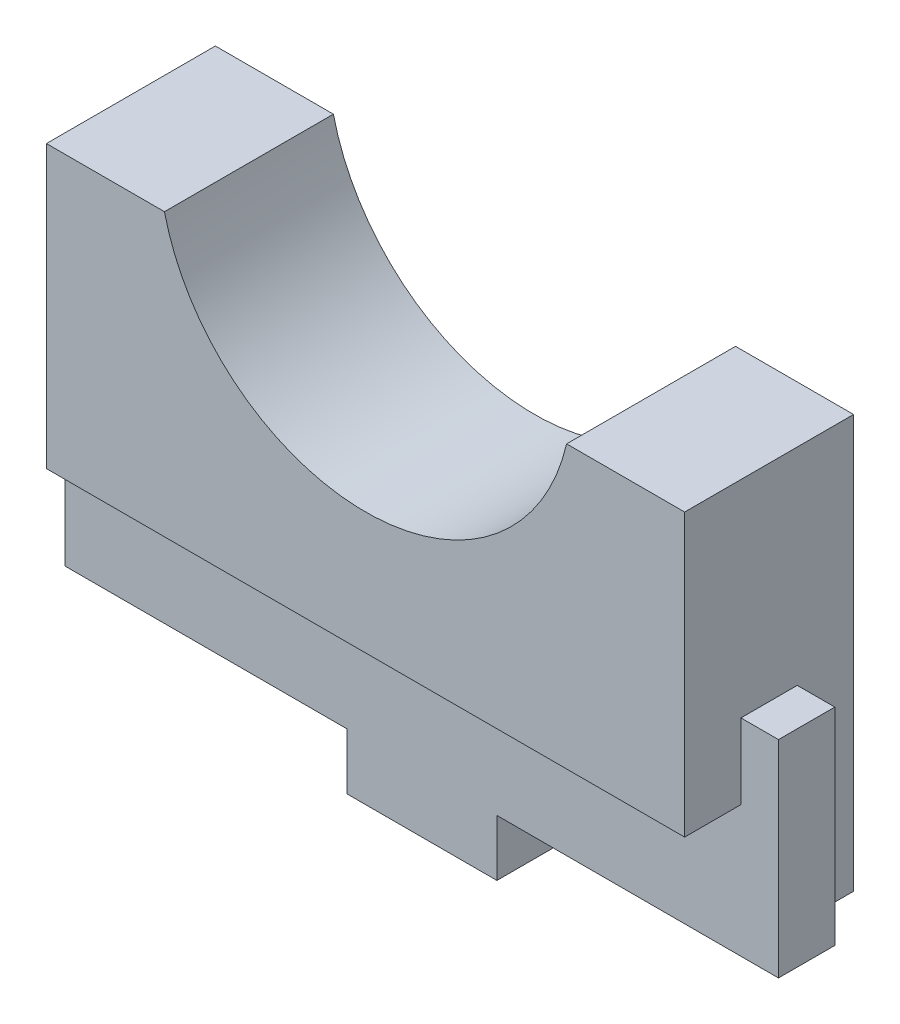
ISO-10303-21;
HEADER;
FILE_DESCRIPTION(('STEP AP214'),'2;1');
FILE_NAME('part.step','',(''),(''),'','','');
FILE_SCHEMA(('AUTOMOTIVE_DESIGN { 1 0 10303 214 1 1 1 1 }'));
ENDSEC;
DATA;
#1=APPLICATION_CONTEXT('core data for automotive mechanical design processes');
#2=APPLICATION_PROTOCOL_DEFINITION('international standard','automotive_design',2000,#1);
#3=PRODUCT_CONTEXT('',#1,'mechanical');
#4=PRODUCT('Part','Part','',(#3));
#5=PRODUCT_RELATED_PRODUCT_CATEGORY('part','',(#4));
#6=PRODUCT_DEFINITION_FORMATION('','',#4);
#7=PRODUCT_DEFINITION_CONTEXT('part definition',#1,'design');
#8=PRODUCT_DEFINITION('design','',#6,#7);
#9=PRODUCT_DEFINITION_SHAPE('','',#8);
#10=(LENGTH_UNIT() NAMED_UNIT(*) SI_UNIT(.MILLI.,.METRE.));
#11=(NAMED_UNIT(*) PLANE_ANGLE_UNIT() SI_UNIT($,.RADIAN.));
#12=(NAMED_UNIT(*) SI_UNIT($,.STERADIAN.) SOLID_ANGLE_UNIT());
#13=UNCERTAINTY_MEASURE_WITH_UNIT(LENGTH_MEASURE(1.E-05),#10,'distance_accuracy_value','');
#14=(GEOMETRIC_REPRESENTATION_CONTEXT(3) GLOBAL_UNCERTAINTY_ASSIGNED_CONTEXT((#13)) GLOBAL_UNIT_ASSIGNED_CONTEXT((#10,
#11,#12)) REPRESENTATION_CONTEXT('',''));
#15=CARTESIAN_POINT('',(0.,0.,0.));
#16=DIRECTION('',(0.,0.,1.));
#17=DIRECTION('',(1.,0.,0.));
#18=AXIS2_PLACEMENT_3D('',#15,#16,#17);
#19=CARTESIAN_POINT('',(17.,0.,9.));
#20=DIRECTION('',(-1.,0.,0.));
#21=DIRECTION('',(0.,0.,1.));
#22=AXIS2_PLACEMENT_3D('',#19,#20,#21);
#23=PLANE('',#22);
#24=DIRECTION('',(0.,1.,0.));
#25=VECTOR('',#24,1.);
#26=CARTESIAN_POINT('',(17.,0.,9.));
#27=LINE('',#26,#25);
#28=CARTESIAN_POINT('',(17.,-17.5,9.));
#29=VERTEX_POINT('',#28);
#30=CARTESIAN_POINT('',(17.,-2.5,9.));
#31=VERTEX_POINT('',#30);
#32=EDGE_CURVE('E173',#29,#31,#27,.T.);
#33=ORIENTED_EDGE('',*,*,#32,.F.);
#34=DIRECTION('',(0.,0.,1.));
#35=VECTOR('',#34,1.);
#36=CARTESIAN_POINT('',(17.,-17.5,6.));
#37=LINE('',#36,#35);
#38=CARTESIAN_POINT('',(17.,-17.5,6.));
#39=VERTEX_POINT('',#38);
#40=EDGE_CURVE('E161',#39,#29,#37,.T.);
#41=ORIENTED_EDGE('',*,*,#40,.F.);
#42=DIRECTION('',(0.,-1.,0.));
#43=VECTOR('',#42,1.);
#44=CARTESIAN_POINT('',(17.,-13.5,6.));
#45=LINE('',#44,#43);
#46=CARTESIAN_POINT('',(17.,-13.5,6.));
#47=VERTEX_POINT('',#46);
#48=EDGE_CURVE('E171',#47,#39,#45,.T.);
#49=ORIENTED_EDGE('',*,*,#48,.F.);
#50=DIRECTION('',(0.,0.,1.));
#51=VECTOR('',#50,1.);
#52=CARTESIAN_POINT('',(17.,-13.5,6.));
#53=LINE('',#52,#51);
#54=CARTESIAN_POINT('',(17.,-13.5,3.));
#55=VERTEX_POINT('',#54);
#56=EDGE_CURVE('E51',#55,#47,#53,.T.);
#57=ORIENTED_EDGE('',*,*,#56,.F.);
#58=DIRECTION('',(0.,1.,0.));
#59=VECTOR('',#58,1.);
#60=CARTESIAN_POINT('',(17.,-13.5,3.));
#61=LINE('',#60,#59);
#62=CARTESIAN_POINT('',(17.,-24.5,3.));
#63=VERTEX_POINT('',#62);
#64=EDGE_CURVE('E56',#63,#55,#61,.T.);
#65=ORIENTED_EDGE('',*,*,#64,.F.);
#66=DIRECTION('',(0.,0.,-1.));
#67=VECTOR('',#66,1.);
#68=CARTESIAN_POINT('',(17.,-24.5,9.));
#69=LINE('',#68,#67);
#70=CARTESIAN_POINT('',(17.,-24.5,0.));
#71=VERTEX_POINT('',#70);
#72=EDGE_CURVE('E221',#63,#71,#69,.T.);
#73=ORIENTED_EDGE('',*,*,#72,.T.);
#74=DIRECTION('',(0.,1.,0.));
#75=VECTOR('',#74,1.);
#76=CARTESIAN_POINT('',(17.,0.,0.));
#77=LINE('',#76,#75);
#78=CARTESIAN_POINT('',(17.,-2.5,0.));
#79=VERTEX_POINT('',#78);
#80=EDGE_CURVE('E310',#71,#79,#77,.T.);
#81=ORIENTED_EDGE('',*,*,#80,.T.);
#82=DIRECTION('',(0.,0.,-1.));
#83=VECTOR('',#82,1.);
#84=CARTESIAN_POINT('',(17.,-2.5,9.));
#85=LINE('',#84,#83);
#86=EDGE_CURVE('E225',#31,#79,#85,.T.);
#87=ORIENTED_EDGE('',*,*,#86,.F.);
#88=EDGE_LOOP('',(#33,#41,#49,#57,#65,#73,#81,#87));
#89=FACE_BOUND('',#88,.T.);
#90=ADVANCED_FACE('F34',(#89),#23,.F.);
#91=CARTESIAN_POINT('',(-17.,0.,9.));
#92=DIRECTION('',(1.,0.,0.));
#93=DIRECTION('',(0.,1.,0.));
#94=AXIS2_PLACEMENT_3D('',#91,#92,#93);
#95=PLANE('',#94);
#96=DIRECTION('',(0.,1.,0.));
#97=VECTOR('',#96,1.);
#98=CARTESIAN_POINT('',(-17.,-13.5,6.));
#99=LINE('',#98,#97);
#100=CARTESIAN_POINT('',(-17.,-17.5,6.));
#101=VERTEX_POINT('',#100);
#102=CARTESIAN_POINT('',(-17.,-13.5,6.));
#103=VERTEX_POINT('',#102);
#104=EDGE_CURVE('E218',#101,#103,#99,.T.);
#105=ORIENTED_EDGE('',*,*,#104,.F.);
#106=DIRECTION('',(0.,0.,1.));
#107=VECTOR('',#106,1.);
#108=CARTESIAN_POINT('',(-17.,-17.5,6.));
#109=LINE('',#108,#107);
#110=CARTESIAN_POINT('',(-17.,-17.5,9.));
#111=VERTEX_POINT('',#110);
#112=EDGE_CURVE('E164',#101,#111,#109,.T.);
#113=ORIENTED_EDGE('',*,*,#112,.T.);
#114=DIRECTION('',(0.,-1.,0.));
#115=VECTOR('',#114,1.);
#116=CARTESIAN_POINT('',(-17.,0.,9.));
#117=LINE('',#116,#115);
#118=CARTESIAN_POINT('',(-17.,-2.5,9.));
#119=VERTEX_POINT('',#118);
#120=EDGE_CURVE('E321',#119,#111,#117,.T.);
#121=ORIENTED_EDGE('',*,*,#120,.F.);
#122=DIRECTION('',(0.,0.,-1.));
#123=VECTOR('',#122,1.);
#124=CARTESIAN_POINT('',(-17.,-2.5,9.));
#125=LINE('',#124,#123);
#126=CARTESIAN_POINT('',(-17.,-2.5,0.));
#127=VERTEX_POINT('',#126);
#128=EDGE_CURVE('E233',#119,#127,#125,.T.);
#129=ORIENTED_EDGE('',*,*,#128,.T.);
#130=DIRECTION('',(0.,-1.,0.));
#131=VECTOR('',#130,1.);
#132=CARTESIAN_POINT('',(-17.,0.,0.));
#133=LINE('',#132,#131);
#134=CARTESIAN_POINT('',(-17.,-24.5,0.));
#135=VERTEX_POINT('',#134);
#136=EDGE_CURVE('E301',#127,#135,#133,.T.);
#137=ORIENTED_EDGE('',*,*,#136,.T.);
#138=DIRECTION('',(0.,0.,-1.));
#139=VECTOR('',#138,1.);
#140=CARTESIAN_POINT('',(-17.,-24.5,9.));
#141=LINE('',#140,#139);
#142=CARTESIAN_POINT('',(-17.,-24.5,3.));
#143=VERTEX_POINT('',#142);
#144=EDGE_CURVE('E224',#143,#135,#141,.T.);
#145=ORIENTED_EDGE('',*,*,#144,.F.);
#146=DIRECTION('',(0.,-1.,0.));
#147=VECTOR('',#146,1.);
#148=CARTESIAN_POINT('',(-17.,-13.5,3.));
#149=LINE('',#148,#147);
#150=CARTESIAN_POINT('',(-17.,-13.5,3.));
#151=VERTEX_POINT('',#150);
#152=EDGE_CURVE('E199',#151,#143,#149,.T.);
#153=ORIENTED_EDGE('',*,*,#152,.F.);
#154=DIRECTION('',(0.,0.,-1.));
#155=VECTOR('',#154,1.);
#156=CARTESIAN_POINT('',(-17.,-13.5,6.));
#157=LINE('',#156,#155);
#158=EDGE_CURVE('E204',#103,#151,#157,.T.);
#159=ORIENTED_EDGE('',*,*,#158,.F.);
#160=EDGE_LOOP('',(#105,#113,#121,#129,#137,#145,#153,#159));
#161=FACE_BOUND('',#160,.T.);
#162=ADVANCED_FACE('F319',(#161),#95,.F.);
#163=CARTESIAN_POINT('',(0.,-24.5,9.));
#164=DIRECTION('',(0.,1.,0.));
#165=DIRECTION('',(-1.,0.,0.));
#166=AXIS2_PLACEMENT_3D('',#163,#164,#165);
#167=PLANE('',#166);
#168=DIRECTION('',(0.,0.,-1.));
#169=VECTOR('',#168,1.);
#170=CARTESIAN_POINT('',(-4.,-24.5,0.));
#171=LINE('',#170,#169);
#172=CARTESIAN_POINT('',(-4.,-24.5,6.));
#173=VERTEX_POINT('',#172);
#174=CARTESIAN_POINT('',(-4.,-24.5,0.));
#175=VERTEX_POINT('',#174);
#176=EDGE_CURVE('E38',#173,#175,#171,.T.);
#177=ORIENTED_EDGE('',*,*,#176,.F.);
#178=DIRECTION('',(1.,0.,0.));
#179=VECTOR('',#178,1.);
#180=CARTESIAN_POINT('',(-19.,-24.5,6.));
#181=LINE('',#180,#179);
#182=CARTESIAN_POINT('',(-19.,-24.5,6.));
#183=VERTEX_POINT('',#182);
#184=EDGE_CURVE('E242',#183,#173,#181,.T.);
#185=ORIENTED_EDGE('',*,*,#184,.F.);
#186=DIRECTION('',(0.,0.,1.));
#187=VECTOR('',#186,1.);
#188=CARTESIAN_POINT('',(-19.,-24.5,6.));
#189=LINE('',#188,#187);
#190=CARTESIAN_POINT('',(-19.,-24.5,3.));
#191=VERTEX_POINT('',#190);
#192=EDGE_CURVE('E203',#191,#183,#189,.T.);
#193=ORIENTED_EDGE('',*,*,#192,.F.);
#194=DIRECTION('',(1.,0.,0.));
#195=VECTOR('',#194,1.);
#196=CARTESIAN_POINT('',(-19.,-24.5,3.));
#197=LINE('',#196,#195);
#198=EDGE_CURVE('E355',#191,#143,#197,.T.);
#199=ORIENTED_EDGE('',*,*,#198,.T.);
#200=ORIENTED_EDGE('',*,*,#144,.T.);
#201=DIRECTION('',(1.,0.,0.));
#202=VECTOR('',#201,1.);
#203=CARTESIAN_POINT('',(0.,-24.5,0.));
#204=LINE('',#203,#202);
#205=EDGE_CURVE('E312',#135,#175,#204,.T.);
#206=ORIENTED_EDGE('',*,*,#205,.T.);
#207=EDGE_LOOP('',(#177,#185,#193,#199,#200,#206));
#208=FACE_BOUND('',#207,.T.);
#209=ADVANCED_FACE('F342',(#208),#167,.F.);
#210=DIRECTION('',(-1.,0.,0.));
#211=VECTOR('',#210,1.);
#212=CARTESIAN_POINT('',(19.,-24.5,6.));
#213=LINE('',#212,#211);
#214=CARTESIAN_POINT('',(19.,-24.5,6.));
#215=VERTEX_POINT('',#214);
#216=CARTESIAN_POINT('',(4.,-24.5,6.));
#217=VERTEX_POINT('',#216);
#218=EDGE_CURVE('E191',#215,#217,#213,.T.);
#219=ORIENTED_EDGE('',*,*,#218,.T.);
#220=DIRECTION('',(0.,0.,1.));
#221=VECTOR('',#220,1.);
#222=CARTESIAN_POINT('',(4.,-24.5,0.));
#223=LINE('',#222,#221);
#224=CARTESIAN_POINT('',(4.,-24.5,0.));
#225=VERTEX_POINT('',#224);
#226=EDGE_CURVE('E266',#225,#217,#223,.T.);
#227=ORIENTED_EDGE('',*,*,#226,.F.);
#228=EDGE_CURVE('E281',#225,#71,#204,.T.);
#229=ORIENTED_EDGE('',*,*,#228,.T.);
#230=ORIENTED_EDGE('',*,*,#72,.F.);
#231=DIRECTION('',(-1.,0.,0.));
#232=VECTOR('',#231,1.);
#233=CARTESIAN_POINT('',(19.,-24.5,3.));
#234=LINE('',#233,#232);
#235=CARTESIAN_POINT('',(19.,-24.5,3.));
#236=VERTEX_POINT('',#235);
#237=EDGE_CURVE('E370',#236,#63,#234,.T.);
#238=ORIENTED_EDGE('',*,*,#237,.F.);
#239=DIRECTION('',(0.,0.,-1.));
#240=VECTOR('',#239,1.);
#241=CARTESIAN_POINT('',(19.,-24.5,6.));
#242=LINE('',#241,#240);
#243=EDGE_CURVE('E369',#215,#236,#242,.T.);
#244=ORIENTED_EDGE('',*,*,#243,.F.);
#245=EDGE_LOOP('',(#219,#227,#229,#230,#238,#244));
#246=FACE_BOUND('',#245,.T.);
#247=ADVANCED_FACE('F334',(#246),#167,.F.);
#248=CARTESIAN_POINT('',(0.,0.,9.));
#249=DIRECTION('',(0.,0.,-1.));
#250=DIRECTION('',(-1.,0.,0.));
#251=AXIS2_PLACEMENT_3D('',#248,#249,#250);
#252=CYLINDRICAL_SURFACE('',#251,11.);
#253=CARTESIAN_POINT('',(0.,0.,0.));
#254=DIRECTION('',(0.,0.,1.));
#255=DIRECTION('',(1.,0.,0.));
#256=AXIS2_PLACEMENT_3D('',#253,#254,#255);
#257=CIRCLE('',#256,11.);
#258=CARTESIAN_POINT('',(-10.7121426428143,-2.5,0.));
#259=VERTEX_POINT('',#258);
#260=CARTESIAN_POINT('',(10.7121426428143,-2.5,0.));
#261=VERTEX_POINT('',#260);
#262=EDGE_CURVE('E289',#259,#261,#257,.T.);
#263=ORIENTED_EDGE('',*,*,#262,.F.);
#264=DIRECTION('',(0.,0.,-1.));
#265=VECTOR('',#264,1.);
#266=CARTESIAN_POINT('',(-10.7121426428143,-2.5,9.));
#267=LINE('',#266,#265);
#268=CARTESIAN_POINT('',(-10.7121426428143,-2.5,9.));
#269=VERTEX_POINT('',#268);
#270=EDGE_CURVE('E44',#269,#259,#267,.T.);
#271=ORIENTED_EDGE('',*,*,#270,.F.);
#272=CARTESIAN_POINT('',(0.,0.,9.));
#273=DIRECTION('',(0.,0.,1.));
#274=DIRECTION('',(1.,0.,0.));
#275=AXIS2_PLACEMENT_3D('',#272,#273,#274);
#276=CIRCLE('',#275,11.);
#277=CARTESIAN_POINT('',(10.7121426428143,-2.5,9.));
#278=VERTEX_POINT('',#277);
#279=EDGE_CURVE('E275',#269,#278,#276,.T.);
#280=ORIENTED_EDGE('',*,*,#279,.T.);
#281=DIRECTION('',(0.,0.,-1.));
#282=VECTOR('',#281,1.);
#283=CARTESIAN_POINT('',(10.7121426428143,-2.5,9.));
#284=LINE('',#283,#282);
#285=EDGE_CURVE('E394',#278,#261,#284,.T.);
#286=ORIENTED_EDGE('',*,*,#285,.T.);
#287=EDGE_LOOP('',(#263,#271,#280,#286));
#288=FACE_BOUND('',#287,.T.);
#289=ADVANCED_FACE('F36',(#288),#252,.F.);
#290=CARTESIAN_POINT('',(0.,-2.5,9.));
#291=DIRECTION('',(0.,1.,0.));
#292=DIRECTION('',(0.,0.,1.));
#293=AXIS2_PLACEMENT_3D('',#290,#291,#292);
#294=PLANE('',#293);
#295=DIRECTION('',(1.,0.,0.));
#296=VECTOR('',#295,1.);
#297=CARTESIAN_POINT('',(0.,-2.5,0.));
#298=LINE('',#297,#296);
#299=EDGE_CURVE('E295',#127,#259,#298,.T.);
#300=ORIENTED_EDGE('',*,*,#299,.F.);
#301=ORIENTED_EDGE('',*,*,#128,.F.);
#302=DIRECTION('',(1.,0.,0.));
#303=VECTOR('',#302,1.);
#304=CARTESIAN_POINT('',(0.,-2.5,9.));
#305=LINE('',#304,#303);
#306=EDGE_CURVE('E390',#119,#269,#305,.T.);
#307=ORIENTED_EDGE('',*,*,#306,.T.);
#308=ORIENTED_EDGE('',*,*,#270,.T.);
#309=EDGE_LOOP('',(#300,#301,#307,#308));
#310=FACE_BOUND('',#309,.T.);
#311=ADVANCED_FACE('F324',(#310),#294,.T.);
#312=EDGE_CURVE('E303',#261,#79,#298,.T.);
#313=ORIENTED_EDGE('',*,*,#312,.F.);
#314=ORIENTED_EDGE('',*,*,#285,.F.);
#315=EDGE_CURVE('E393',#278,#31,#305,.T.);
#316=ORIENTED_EDGE('',*,*,#315,.T.);
#317=ORIENTED_EDGE('',*,*,#86,.T.);
#318=EDGE_LOOP('',(#313,#314,#316,#317));
#319=FACE_BOUND('',#318,.T.);
#320=ADVANCED_FACE('F326',(#319),#294,.T.);
#321=CARTESIAN_POINT('',(0.,0.,9.));
#322=DIRECTION('',(0.,0.,1.));
#323=DIRECTION('',(1.,0.,0.));
#324=AXIS2_PLACEMENT_3D('',#321,#322,#323);
#325=PLANE('',#324);
#326=DIRECTION('',(-1.,0.,0.));
#327=VECTOR('',#326,1.);
#328=CARTESIAN_POINT('',(-17.,-17.5,9.));
#329=LINE('',#328,#327);
#330=EDGE_CURVE('E168',#29,#111,#329,.T.);
#331=ORIENTED_EDGE('',*,*,#330,.F.);
#332=ORIENTED_EDGE('',*,*,#32,.T.);
#333=ORIENTED_EDGE('',*,*,#315,.F.);
#334=ORIENTED_EDGE('',*,*,#279,.F.);
#335=ORIENTED_EDGE('',*,*,#306,.F.);
#336=ORIENTED_EDGE('',*,*,#120,.T.);
#337=EDGE_LOOP('',(#331,#332,#333,#334,#335,#336));
#338=FACE_BOUND('',#337,.T.);
#339=ADVANCED_FACE('F332',(#338),#325,.T.);
#340=CARTESIAN_POINT('',(0.,0.,0.));
#341=DIRECTION('',(0.,0.,1.));
#342=DIRECTION('',(1.,0.,0.));
#343=AXIS2_PLACEMENT_3D('',#340,#341,#342);
#344=PLANE('',#343);
#345=ORIENTED_EDGE('',*,*,#262,.T.);
#346=ORIENTED_EDGE('',*,*,#312,.T.);
#347=ORIENTED_EDGE('',*,*,#80,.F.);
#348=ORIENTED_EDGE('',*,*,#228,.F.);
#349=DIRECTION('',(0.,1.,0.));
#350=VECTOR('',#349,1.);
#351=CARTESIAN_POINT('',(4.,-27.5,0.));
#352=LINE('',#351,#350);
#353=CARTESIAN_POINT('',(4.,-27.5,0.));
#354=VERTEX_POINT('',#353);
#355=EDGE_CURVE('E270',#354,#225,#352,.T.);
#356=ORIENTED_EDGE('',*,*,#355,.F.);
#357=DIRECTION('',(1.,0.,0.));
#358=VECTOR('',#357,1.);
#359=CARTESIAN_POINT('',(4.,-27.5,0.));
#360=LINE('',#359,#358);
#361=CARTESIAN_POINT('',(-4.,-27.5,0.));
#362=VERTEX_POINT('',#361);
#363=EDGE_CURVE('E265',#362,#354,#360,.T.);
#364=ORIENTED_EDGE('',*,*,#363,.F.);
#365=DIRECTION('',(0.,1.,0.));
#366=VECTOR('',#365,1.);
#367=CARTESIAN_POINT('',(-4.,-27.5,0.));
#368=LINE('',#367,#366);
#369=EDGE_CURVE('E286',#362,#175,#368,.T.);
#370=ORIENTED_EDGE('',*,*,#369,.T.);
#371=ORIENTED_EDGE('',*,*,#205,.F.);
#372=ORIENTED_EDGE('',*,*,#136,.F.);
#373=ORIENTED_EDGE('',*,*,#299,.T.);
#374=EDGE_LOOP('',(#345,#346,#347,#348,#356,#364,#370,#371,#372,#373));
#375=FACE_BOUND('',#374,.T.);
#376=ADVANCED_FACE('F323',(#375),#344,.F.);
#377=CARTESIAN_POINT('',(-4.,-27.5,0.));
#378=DIRECTION('',(1.,0.,0.));
#379=DIRECTION('',(0.,1.,0.));
#380=AXIS2_PLACEMENT_3D('',#377,#378,#379);
#381=PLANE('',#380);
#382=DIRECTION('',(0.,0.,-1.));
#383=VECTOR('',#382,1.);
#384=CARTESIAN_POINT('',(-4.,-27.5,0.));
#385=LINE('',#384,#383);
#386=CARTESIAN_POINT('',(-4.,-27.5,6.));
#387=VERTEX_POINT('',#386);
#388=EDGE_CURVE('E263',#387,#362,#385,.T.);
#389=ORIENTED_EDGE('',*,*,#388,.F.);
#390=DIRECTION('',(0.,1.,0.));
#391=VECTOR('',#390,1.);
#392=CARTESIAN_POINT('',(-4.,-27.5,6.));
#393=LINE('',#392,#391);
#394=EDGE_CURVE('E358',#387,#173,#393,.T.);
#395=ORIENTED_EDGE('',*,*,#394,.T.);
#396=ORIENTED_EDGE('',*,*,#176,.T.);
#397=ORIENTED_EDGE('',*,*,#369,.F.);
#398=EDGE_LOOP('',(#389,#395,#396,#397));
#399=FACE_BOUND('',#398,.T.);
#400=ADVANCED_FACE('F361',(#399),#381,.F.);
#401=CARTESIAN_POINT('',(4.,-27.5,0.));
#402=DIRECTION('',(-1.,0.,0.));
#403=DIRECTION('',(0.,0.,1.));
#404=AXIS2_PLACEMENT_3D('',#401,#402,#403);
#405=PLANE('',#404);
#406=ORIENTED_EDGE('',*,*,#226,.T.);
#407=DIRECTION('',(0.,-1.,0.));
#408=VECTOR('',#407,1.);
#409=CARTESIAN_POINT('',(4.,-27.5,6.));
#410=LINE('',#409,#408);
#411=CARTESIAN_POINT('',(4.,-27.5,6.));
#412=VERTEX_POINT('',#411);
#413=EDGE_CURVE('E362',#217,#412,#410,.T.);
#414=ORIENTED_EDGE('',*,*,#413,.T.);
#415=DIRECTION('',(0.,0.,1.));
#416=VECTOR('',#415,1.);
#417=CARTESIAN_POINT('',(4.,-27.5,0.));
#418=LINE('',#417,#416);
#419=EDGE_CURVE('E268',#354,#412,#418,.T.);
#420=ORIENTED_EDGE('',*,*,#419,.F.);
#421=ORIENTED_EDGE('',*,*,#355,.T.);
#422=EDGE_LOOP('',(#406,#414,#420,#421));
#423=FACE_BOUND('',#422,.T.);
#424=ADVANCED_FACE('F384',(#423),#405,.F.);
#425=CARTESIAN_POINT('',(0.,-27.5,0.));
#426=DIRECTION('',(0.,-1.,0.));
#427=DIRECTION('',(0.,0.,-1.));
#428=AXIS2_PLACEMENT_3D('',#425,#426,#427);
#429=PLANE('',#428);
#430=DIRECTION('',(1.,0.,0.));
#431=VECTOR('',#430,1.);
#432=CARTESIAN_POINT('',(0.,-27.5,6.));
#433=LINE('',#432,#431);
#434=EDGE_CURVE('E11',#387,#412,#433,.T.);
#435=ORIENTED_EDGE('',*,*,#434,.F.);
#436=ORIENTED_EDGE('',*,*,#388,.T.);
#437=ORIENTED_EDGE('',*,*,#363,.T.);
#438=ORIENTED_EDGE('',*,*,#419,.T.);
#439=EDGE_LOOP('',(#435,#436,#437,#438));
#440=FACE_BOUND('',#439,.T.);
#441=ADVANCED_FACE('F408',(#440),#429,.T.);
#442=CARTESIAN_POINT('',(-19.,-13.5,3.));
#443=DIRECTION('',(0.,0.,1.));
#444=DIRECTION('',(0.,-1.,0.));
#445=AXIS2_PLACEMENT_3D('',#442,#443,#444);
#446=PLANE('',#445);
#447=ORIENTED_EDGE('',*,*,#152,.T.);
#448=ORIENTED_EDGE('',*,*,#198,.F.);
#449=DIRECTION('',(0.,-1.,0.));
#450=VECTOR('',#449,1.);
#451=CARTESIAN_POINT('',(-19.,-13.5,3.));
#452=LINE('',#451,#450);
#453=CARTESIAN_POINT('',(-19.,-13.5,3.));
#454=VERTEX_POINT('',#453);
#455=EDGE_CURVE('E200',#454,#191,#452,.T.);
#456=ORIENTED_EDGE('',*,*,#455,.F.);
#457=DIRECTION('',(1.,0.,0.));
#458=VECTOR('',#457,1.);
#459=CARTESIAN_POINT('',(-19.,-13.5,3.));
#460=LINE('',#459,#458);
#461=EDGE_CURVE('E210',#454,#151,#460,.T.);
#462=ORIENTED_EDGE('',*,*,#461,.T.);
#463=EDGE_LOOP('',(#447,#448,#456,#462));
#464=FACE_BOUND('',#463,.T.);
#465=ADVANCED_FACE('F259',(#464),#446,.F.);
#466=CARTESIAN_POINT('',(-19.,-13.5,6.));
#467=DIRECTION('',(0.,0.,-1.));
#468=DIRECTION('',(-1.,0.,0.));
#469=AXIS2_PLACEMENT_3D('',#466,#467,#468);
#470=PLANE('',#469);
#471=ORIENTED_EDGE('',*,*,#184,.T.);
#472=ORIENTED_EDGE('',*,*,#394,.F.);
#473=ORIENTED_EDGE('',*,*,#434,.T.);
#474=ORIENTED_EDGE('',*,*,#413,.F.);
#475=ORIENTED_EDGE('',*,*,#218,.F.);
#476=DIRECTION('',(0.,-1.,0.));
#477=VECTOR('',#476,1.);
#478=CARTESIAN_POINT('',(19.,-13.5,6.));
#479=LINE('',#478,#477);
#480=CARTESIAN_POINT('',(19.,-13.5,6.));
#481=VERTEX_POINT('',#480);
#482=EDGE_CURVE('E368',#481,#215,#479,.T.);
#483=ORIENTED_EDGE('',*,*,#482,.F.);
#484=DIRECTION('',(-1.,0.,0.));
#485=VECTOR('',#484,1.);
#486=CARTESIAN_POINT('',(19.,-13.5,6.));
#487=LINE('',#486,#485);
#488=EDGE_CURVE('E179',#481,#47,#487,.T.);
#489=ORIENTED_EDGE('',*,*,#488,.T.);
#490=ORIENTED_EDGE('',*,*,#48,.T.);
#491=DIRECTION('',(-1.,0.,0.));
#492=VECTOR('',#491,1.);
#493=CARTESIAN_POINT('',(-17.,-17.5,6.));
#494=LINE('',#493,#492);
#495=EDGE_CURVE('E158',#39,#101,#494,.T.);
#496=ORIENTED_EDGE('',*,*,#495,.T.);
#497=ORIENTED_EDGE('',*,*,#104,.T.);
#498=DIRECTION('',(1.,0.,0.));
#499=VECTOR('',#498,1.);
#500=CARTESIAN_POINT('',(-19.,-13.5,6.));
#501=LINE('',#500,#499);
#502=CARTESIAN_POINT('',(-19.,-13.5,6.));
#503=VERTEX_POINT('',#502);
#504=EDGE_CURVE('E256',#503,#103,#501,.T.);
#505=ORIENTED_EDGE('',*,*,#504,.F.);
#506=DIRECTION('',(0.,1.,0.));
#507=VECTOR('',#506,1.);
#508=CARTESIAN_POINT('',(-19.,-13.5,6.));
#509=LINE('',#508,#507);
#510=EDGE_CURVE('E206',#183,#503,#509,.T.);
#511=ORIENTED_EDGE('',*,*,#510,.F.);
#512=EDGE_LOOP('',(#471,#472,#473,#474,#475,#483,#489,#490,#496,#497,#505,#511));
#513=FACE_BOUND('',#512,.T.);
#514=ADVANCED_FACE('F176',(#513),#470,.F.);
#515=CARTESIAN_POINT('',(-19.,-13.5,6.));
#516=DIRECTION('',(0.,-1.,0.));
#517=DIRECTION('',(0.,0.,-1.));
#518=AXIS2_PLACEMENT_3D('',#515,#516,#517);
#519=PLANE('',#518);
#520=ORIENTED_EDGE('',*,*,#158,.T.);
#521=ORIENTED_EDGE('',*,*,#461,.F.);
#522=DIRECTION('',(0.,0.,-1.));
#523=VECTOR('',#522,1.);
#524=CARTESIAN_POINT('',(-19.,-13.5,6.));
#525=LINE('',#524,#523);
#526=EDGE_CURVE('E208',#503,#454,#525,.T.);
#527=ORIENTED_EDGE('',*,*,#526,.F.);
#528=ORIENTED_EDGE('',*,*,#504,.T.);
#529=EDGE_LOOP('',(#520,#521,#527,#528));
#530=FACE_BOUND('',#529,.T.);
#531=ADVANCED_FACE('F253',(#530),#519,.F.);
#532=CARTESIAN_POINT('',(-19.,0.,0.));
#533=DIRECTION('',(1.,0.,0.));
#534=DIRECTION('',(0.,1.,0.));
#535=AXIS2_PLACEMENT_3D('',#532,#533,#534);
#536=PLANE('',#535);
#537=ORIENTED_EDGE('',*,*,#455,.T.);
#538=ORIENTED_EDGE('',*,*,#192,.T.);
#539=ORIENTED_EDGE('',*,*,#510,.T.);
#540=ORIENTED_EDGE('',*,*,#526,.T.);
#541=EDGE_LOOP('',(#537,#538,#539,#540));
#542=FACE_BOUND('',#541,.T.);
#543=ADVANCED_FACE('F418',(#542),#536,.F.);
#544=CARTESIAN_POINT('',(19.,-13.5,3.));
#545=DIRECTION('',(0.,0.,1.));
#546=DIRECTION('',(0.,-1.,0.));
#547=AXIS2_PLACEMENT_3D('',#544,#545,#546);
#548=PLANE('',#547);
#549=ORIENTED_EDGE('',*,*,#64,.T.);
#550=DIRECTION('',(-1.,0.,0.));
#551=VECTOR('',#550,1.);
#552=CARTESIAN_POINT('',(19.,-13.5,3.));
#553=LINE('',#552,#551);
#554=CARTESIAN_POINT('',(19.,-13.5,3.));
#555=VERTEX_POINT('',#554);
#556=EDGE_CURVE('E197',#555,#55,#553,.T.);
#557=ORIENTED_EDGE('',*,*,#556,.F.);
#558=DIRECTION('',(0.,1.,0.));
#559=VECTOR('',#558,1.);
#560=CARTESIAN_POINT('',(19.,-13.5,3.));
#561=LINE('',#560,#559);
#562=EDGE_CURVE('E180',#236,#555,#561,.T.);
#563=ORIENTED_EDGE('',*,*,#562,.F.);
#564=ORIENTED_EDGE('',*,*,#237,.T.);
#565=EDGE_LOOP('',(#549,#557,#563,#564));
#566=FACE_BOUND('',#565,.T.);
#567=ADVANCED_FACE('F421',(#566),#548,.F.);
#568=CARTESIAN_POINT('',(19.,-13.5,6.));
#569=DIRECTION('',(0.,-1.,0.));
#570=DIRECTION('',(0.,0.,-1.));
#571=AXIS2_PLACEMENT_3D('',#568,#569,#570);
#572=PLANE('',#571);
#573=ORIENTED_EDGE('',*,*,#56,.T.);
#574=ORIENTED_EDGE('',*,*,#488,.F.);
#575=DIRECTION('',(0.,0.,1.));
#576=VECTOR('',#575,1.);
#577=CARTESIAN_POINT('',(19.,-13.5,6.));
#578=LINE('',#577,#576);
#579=EDGE_CURVE('E183',#555,#481,#578,.T.);
#580=ORIENTED_EDGE('',*,*,#579,.F.);
#581=ORIENTED_EDGE('',*,*,#556,.T.);
#582=EDGE_LOOP('',(#573,#574,#580,#581));
#583=FACE_BOUND('',#582,.T.);
#584=ADVANCED_FACE('F425',(#583),#572,.F.);
#585=CARTESIAN_POINT('',(19.,0.,0.));
#586=DIRECTION('',(1.,0.,0.));
#587=DIRECTION('',(0.,0.,-1.));
#588=AXIS2_PLACEMENT_3D('',#585,#586,#587);
#589=PLANE('',#588);
#590=ORIENTED_EDGE('',*,*,#562,.T.);
#591=ORIENTED_EDGE('',*,*,#579,.T.);
#592=ORIENTED_EDGE('',*,*,#482,.T.);
#593=ORIENTED_EDGE('',*,*,#243,.T.);
#594=EDGE_LOOP('',(#590,#591,#592,#593));
#595=FACE_BOUND('',#594,.T.);
#596=ADVANCED_FACE('F428',(#595),#589,.T.);
#597=CARTESIAN_POINT('',(-17.,-17.5,6.));
#598=DIRECTION('',(0.,1.,0.));
#599=DIRECTION('',(0.,0.,1.));
#600=AXIS2_PLACEMENT_3D('',#597,#598,#599);
#601=PLANE('',#600);
#602=ORIENTED_EDGE('',*,*,#330,.T.);
#603=ORIENTED_EDGE('',*,*,#112,.F.);
#604=ORIENTED_EDGE('',*,*,#495,.F.);
#605=ORIENTED_EDGE('',*,*,#40,.T.);
#606=EDGE_LOOP('',(#602,#603,#604,#605));
#607=FACE_BOUND('',#606,.T.);
#608=ADVANCED_FACE('F160',(#607),#601,.F.);
#609=CLOSED_SHELL('',(#90,#162,#209,#247,#289,#311,#320,#339,#376,#400,#424,#441,#465,#514,#531,
#543,#567,#584,#596,#608));
#610=MANIFOLD_SOLID_BREP('B2',#609);
#611=ADVANCED_BREP_SHAPE_REPRESENTATION('',(#18,#610),#14);
#612=SHAPE_DEFINITION_REPRESENTATION(#9,#611);
ENDSEC;
END-ISO-10303-21;
